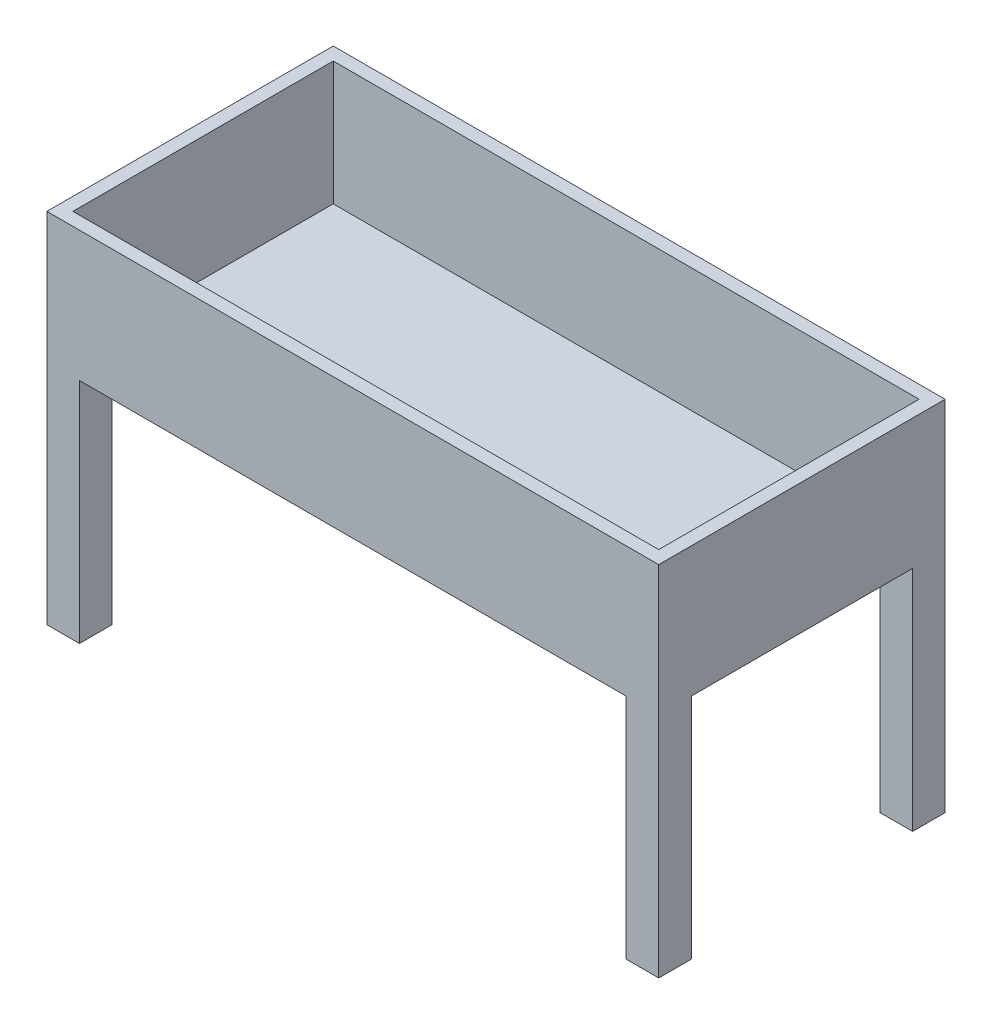
ISO-10303-21;
HEADER;
FILE_DESCRIPTION(('STEP AP214'),'2;1');
FILE_NAME('part.step','',(''),(''),'','','');
FILE_SCHEMA(('AUTOMOTIVE_DESIGN { 1 0 10303 214 1 1 1 1 }'));
ENDSEC;
DATA;
#1=APPLICATION_CONTEXT('core data for automotive mechanical design processes');
#2=APPLICATION_PROTOCOL_DEFINITION('international standard','automotive_design',2000,#1);
#3=PRODUCT_CONTEXT('',#1,'mechanical');
#4=PRODUCT('Part','Part','',(#3));
#5=PRODUCT_RELATED_PRODUCT_CATEGORY('part','',(#4));
#6=PRODUCT_DEFINITION_FORMATION('','',#4);
#7=PRODUCT_DEFINITION_CONTEXT('part definition',#1,'design');
#8=PRODUCT_DEFINITION('design','',#6,#7);
#9=PRODUCT_DEFINITION_SHAPE('','',#8);
#10=(LENGTH_UNIT() NAMED_UNIT(*) SI_UNIT(.MILLI.,.METRE.));
#11=(NAMED_UNIT(*) PLANE_ANGLE_UNIT() SI_UNIT($,.RADIAN.));
#12=(NAMED_UNIT(*) SI_UNIT($,.STERADIAN.) SOLID_ANGLE_UNIT());
#13=UNCERTAINTY_MEASURE_WITH_UNIT(LENGTH_MEASURE(1.E-05),#10,'distance_accuracy_value','');
#14=(GEOMETRIC_REPRESENTATION_CONTEXT(3) GLOBAL_UNCERTAINTY_ASSIGNED_CONTEXT((#13)) GLOBAL_UNIT_ASSIGNED_CONTEXT((#10,
#11,#12)) REPRESENTATION_CONTEXT('',''));
#15=CARTESIAN_POINT('',(0.,0.,0.));
#16=DIRECTION('',(0.,0.,1.));
#17=DIRECTION('',(1.,0.,0.));
#18=AXIS2_PLACEMENT_3D('',#15,#16,#17);
#19=CARTESIAN_POINT('',(0.,0.,0.));
#20=DIRECTION('',(0.,-1.,0.));
#21=DIRECTION('',(0.,0.,-1.));
#22=AXIS2_PLACEMENT_3D('',#19,#20,#21);
#23=PLANE('',#22);
#24=DIRECTION('',(-1.,0.,0.));
#25=VECTOR('',#24,1.);
#26=CARTESIAN_POINT('',(0.,0.,-39.));
#27=LINE('',#26,#25);
#28=CARTESIAN_POINT('',(5.,0.,-39.));
#29=VERTEX_POINT('',#28);
#30=CARTESIAN_POINT('',(0.,0.,-39.));
#31=VERTEX_POINT('',#30);
#32=EDGE_CURVE('E58',#29,#31,#27,.T.);
#33=ORIENTED_EDGE('',*,*,#32,.F.);
#34=DIRECTION('',(0.,0.,1.));
#35=VECTOR('',#34,1.);
#36=CARTESIAN_POINT('',(5.,0.,-44.));
#37=LINE('',#36,#35);
#38=CARTESIAN_POINT('',(5.,0.,-44.));
#39=VERTEX_POINT('',#38);
#40=EDGE_CURVE('E189',#39,#29,#37,.T.);
#41=ORIENTED_EDGE('',*,*,#40,.F.);
#42=DIRECTION('',(1.,0.,0.));
#43=VECTOR('',#42,1.);
#44=CARTESIAN_POINT('',(0.,0.,-44.));
#45=LINE('',#44,#43);
#46=CARTESIAN_POINT('',(89.,0.,-44.));
#47=VERTEX_POINT('',#46);
#48=EDGE_CURVE('E178',#39,#47,#45,.T.);
#49=ORIENTED_EDGE('',*,*,#48,.T.);
#50=DIRECTION('',(0.,0.,-1.));
#51=VECTOR('',#50,1.);
#52=CARTESIAN_POINT('',(89.,0.,-44.));
#53=LINE('',#52,#51);
#54=CARTESIAN_POINT('',(89.,0.,-39.));
#55=VERTEX_POINT('',#54);
#56=EDGE_CURVE('E221',#55,#47,#53,.T.);
#57=ORIENTED_EDGE('',*,*,#56,.F.);
#58=DIRECTION('',(-1.,0.,0.));
#59=VECTOR('',#58,1.);
#60=CARTESIAN_POINT('',(94.,0.,-39.));
#61=LINE('',#60,#59);
#62=CARTESIAN_POINT('',(94.,0.,-39.));
#63=VERTEX_POINT('',#62);
#64=EDGE_CURVE('E223',#63,#55,#61,.T.);
#65=ORIENTED_EDGE('',*,*,#64,.F.);
#66=DIRECTION('',(0.,0.,-1.));
#67=VECTOR('',#66,1.);
#68=CARTESIAN_POINT('',(94.,0.,0.));
#69=LINE('',#68,#67);
#70=CARTESIAN_POINT('',(94.,0.,-5.00000000000002));
#71=VERTEX_POINT('',#70);
#72=EDGE_CURVE('E187',#71,#63,#69,.T.);
#73=ORIENTED_EDGE('',*,*,#72,.F.);
#74=DIRECTION('',(1.,0.,0.));
#75=VECTOR('',#74,1.);
#76=CARTESIAN_POINT('',(94.,0.,-5.00000000000002));
#77=LINE('',#76,#75);
#78=CARTESIAN_POINT('',(89.,0.,-5.00000000000001));
#79=VERTEX_POINT('',#78);
#80=EDGE_CURVE('E243',#79,#71,#77,.T.);
#81=ORIENTED_EDGE('',*,*,#80,.F.);
#82=DIRECTION('',(0.,0.,-1.));
#83=VECTOR('',#82,1.);
#84=CARTESIAN_POINT('',(89.,0.,0.));
#85=LINE('',#84,#83);
#86=CARTESIAN_POINT('',(89.,0.,0.));
#87=VERTEX_POINT('',#86);
#88=EDGE_CURVE('E246',#87,#79,#85,.T.);
#89=ORIENTED_EDGE('',*,*,#88,.F.);
#90=DIRECTION('',(1.,0.,0.));
#91=VECTOR('',#90,1.);
#92=CARTESIAN_POINT('',(0.,0.,0.));
#93=LINE('',#92,#91);
#94=CARTESIAN_POINT('',(5.,0.,0.));
#95=VERTEX_POINT('',#94);
#96=EDGE_CURVE('E318',#95,#87,#93,.T.);
#97=ORIENTED_EDGE('',*,*,#96,.F.);
#98=DIRECTION('',(0.,0.,1.));
#99=VECTOR('',#98,1.);
#100=CARTESIAN_POINT('',(5.,0.,0.));
#101=LINE('',#100,#99);
#102=CARTESIAN_POINT('',(5.,0.,-5.));
#103=VERTEX_POINT('',#102);
#104=EDGE_CURVE('E262',#103,#95,#101,.T.);
#105=ORIENTED_EDGE('',*,*,#104,.F.);
#106=DIRECTION('',(1.,0.,0.));
#107=VECTOR('',#106,1.);
#108=CARTESIAN_POINT('',(0.,0.,-5.));
#109=LINE('',#108,#107);
#110=CARTESIAN_POINT('',(0.,0.,-5.));
#111=VERTEX_POINT('',#110);
#112=EDGE_CURVE('E249',#111,#103,#109,.T.);
#113=ORIENTED_EDGE('',*,*,#112,.F.);
#114=DIRECTION('',(0.,0.,-1.));
#115=VECTOR('',#114,1.);
#116=CARTESIAN_POINT('',(0.,0.,0.));
#117=LINE('',#116,#115);
#118=EDGE_CURVE('E63',#111,#31,#117,.T.);
#119=ORIENTED_EDGE('',*,*,#118,.T.);
#120=EDGE_LOOP('',(#33,#41,#49,#57,#65,#73,#81,#89,#97,#105,#113,#119));
#121=FACE_BOUND('',#120,.T.);
#122=ADVANCED_FACE('F41',(#121),#23,.T.);
#123=CARTESIAN_POINT('',(0.,20.,0.));
#124=DIRECTION('',(-1.,0.,0.));
#125=DIRECTION('',(0.,0.,1.));
#126=AXIS2_PLACEMENT_3D('',#123,#124,#125);
#127=PLANE('',#126);
#128=ORIENTED_EDGE('',*,*,#118,.F.);
#129=DIRECTION('',(0.,1.,0.));
#130=VECTOR('',#129,1.);
#131=CARTESIAN_POINT('',(0.,-35.,-5.));
#132=LINE('',#131,#130);
#133=CARTESIAN_POINT('',(0.,-35.,-5.));
#134=VERTEX_POINT('',#133);
#135=EDGE_CURVE('E279',#134,#111,#132,.T.);
#136=ORIENTED_EDGE('',*,*,#135,.F.);
#137=DIRECTION('',(0.,0.,-1.));
#138=VECTOR('',#137,1.);
#139=CARTESIAN_POINT('',(0.,-35.,0.));
#140=LINE('',#139,#138);
#141=CARTESIAN_POINT('',(0.,-35.,0.));
#142=VERTEX_POINT('',#141);
#143=EDGE_CURVE('E258',#142,#134,#140,.T.);
#144=ORIENTED_EDGE('',*,*,#143,.F.);
#145=DIRECTION('',(0.,-1.,0.));
#146=VECTOR('',#145,1.);
#147=CARTESIAN_POINT('',(0.,20.,0.));
#148=LINE('',#147,#146);
#149=CARTESIAN_POINT('',(0.,20.,0.));
#150=VERTEX_POINT('',#149);
#151=EDGE_CURVE('E11',#150,#142,#148,.T.);
#152=ORIENTED_EDGE('',*,*,#151,.F.);
#153=DIRECTION('',(0.,0.,-1.));
#154=VECTOR('',#153,1.);
#155=CARTESIAN_POINT('',(0.,20.,0.));
#156=LINE('',#155,#154);
#157=CARTESIAN_POINT('',(0.,20.,-44.));
#158=VERTEX_POINT('',#157);
#159=EDGE_CURVE('E314',#150,#158,#156,.T.);
#160=ORIENTED_EDGE('',*,*,#159,.T.);
#161=DIRECTION('',(0.,-1.,0.));
#162=VECTOR('',#161,1.);
#163=CARTESIAN_POINT('',(0.,20.,-44.));
#164=LINE('',#163,#162);
#165=CARTESIAN_POINT('',(0.,-35.,-44.));
#166=VERTEX_POINT('',#165);
#167=EDGE_CURVE('E45',#158,#166,#164,.T.);
#168=ORIENTED_EDGE('',*,*,#167,.T.);
#169=DIRECTION('',(0.,0.,-1.));
#170=VECTOR('',#169,1.);
#171=CARTESIAN_POINT('',(0.,-35.,-44.));
#172=LINE('',#171,#170);
#173=CARTESIAN_POINT('',(0.,-35.,-39.));
#174=VERTEX_POINT('',#173);
#175=EDGE_CURVE('E205',#174,#166,#172,.T.);
#176=ORIENTED_EDGE('',*,*,#175,.F.);
#177=DIRECTION('',(0.,1.,0.));
#178=VECTOR('',#177,1.);
#179=CARTESIAN_POINT('',(0.,-35.,-39.));
#180=LINE('',#179,#178);
#181=EDGE_CURVE('E200',#174,#31,#180,.T.);
#182=ORIENTED_EDGE('',*,*,#181,.T.);
#183=EDGE_LOOP('',(#128,#136,#144,#152,#160,#168,#176,#182));
#184=FACE_BOUND('',#183,.T.);
#185=ADVANCED_FACE('F43',(#184),#127,.T.);
#186=CARTESIAN_POINT('',(0.,20.,0.));
#187=DIRECTION('',(0.,0.,-1.));
#188=DIRECTION('',(-1.,0.,0.));
#189=AXIS2_PLACEMENT_3D('',#186,#187,#188);
#190=PLANE('',#189);
#191=ORIENTED_EDGE('',*,*,#151,.T.);
#192=DIRECTION('',(-1.,0.,0.));
#193=VECTOR('',#192,1.);
#194=CARTESIAN_POINT('',(0.,-35.,0.));
#195=LINE('',#194,#193);
#196=CARTESIAN_POINT('',(5.,-35.,0.));
#197=VERTEX_POINT('',#196);
#198=EDGE_CURVE('E266',#197,#142,#195,.T.);
#199=ORIENTED_EDGE('',*,*,#198,.F.);
#200=DIRECTION('',(0.,1.,0.));
#201=VECTOR('',#200,1.);
#202=CARTESIAN_POINT('',(5.,-35.,0.));
#203=LINE('',#202,#201);
#204=EDGE_CURVE('E269',#197,#95,#203,.T.);
#205=ORIENTED_EDGE('',*,*,#204,.T.);
#206=ORIENTED_EDGE('',*,*,#96,.T.);
#207=DIRECTION('',(0.,1.,0.));
#208=VECTOR('',#207,1.);
#209=CARTESIAN_POINT('',(89.,-35.,0.));
#210=LINE('',#209,#208);
#211=CARTESIAN_POINT('',(89.,-35.,0.));
#212=VERTEX_POINT('',#211);
#213=EDGE_CURVE('E227',#212,#87,#210,.T.);
#214=ORIENTED_EDGE('',*,*,#213,.F.);
#215=DIRECTION('',(-1.,0.,0.));
#216=VECTOR('',#215,1.);
#217=CARTESIAN_POINT('',(94.,-35.,0.));
#218=LINE('',#217,#216);
#219=CARTESIAN_POINT('',(94.,-35.,0.));
#220=VERTEX_POINT('',#219);
#221=EDGE_CURVE('E247',#220,#212,#218,.T.);
#222=ORIENTED_EDGE('',*,*,#221,.F.);
#223=DIRECTION('',(0.,-1.,0.));
#224=VECTOR('',#223,1.);
#225=CARTESIAN_POINT('',(94.,20.,0.));
#226=LINE('',#225,#224);
#227=CARTESIAN_POINT('',(94.,20.,0.));
#228=VERTEX_POINT('',#227);
#229=EDGE_CURVE('E50',#228,#220,#226,.T.);
#230=ORIENTED_EDGE('',*,*,#229,.F.);
#231=DIRECTION('',(1.,0.,0.));
#232=VECTOR('',#231,1.);
#233=CARTESIAN_POINT('',(0.,20.,0.));
#234=LINE('',#233,#232);
#235=EDGE_CURVE('E323',#150,#228,#234,.T.);
#236=ORIENTED_EDGE('',*,*,#235,.F.);
#237=EDGE_LOOP('',(#191,#199,#205,#206,#214,#222,#230,#236));
#238=FACE_BOUND('',#237,.T.);
#239=ADVANCED_FACE('F354',(#238),#190,.F.);
#240=CARTESIAN_POINT('',(94.,20.,0.));
#241=DIRECTION('',(-1.,0.,0.));
#242=DIRECTION('',(0.,0.,1.));
#243=AXIS2_PLACEMENT_3D('',#240,#241,#242);
#244=PLANE('',#243);
#245=ORIENTED_EDGE('',*,*,#229,.T.);
#246=DIRECTION('',(0.,0.,1.));
#247=VECTOR('',#246,1.);
#248=CARTESIAN_POINT('',(94.,-35.,0.));
#249=LINE('',#248,#247);
#250=CARTESIAN_POINT('',(94.,-35.,-5.00000000000002));
#251=VERTEX_POINT('',#250);
#252=EDGE_CURVE('E242',#251,#220,#249,.T.);
#253=ORIENTED_EDGE('',*,*,#252,.F.);
#254=DIRECTION('',(0.,1.,0.));
#255=VECTOR('',#254,1.);
#256=CARTESIAN_POINT('',(94.,-35.,-5.00000000000002));
#257=LINE('',#256,#255);
#258=EDGE_CURVE('E240',#251,#71,#257,.T.);
#259=ORIENTED_EDGE('',*,*,#258,.T.);
#260=ORIENTED_EDGE('',*,*,#72,.T.);
#261=DIRECTION('',(0.,1.,0.));
#262=VECTOR('',#261,1.);
#263=CARTESIAN_POINT('',(94.,-35.,-39.));
#264=LINE('',#263,#262);
#265=CARTESIAN_POINT('',(94.,-35.,-39.));
#266=VERTEX_POINT('',#265);
#267=EDGE_CURVE('E193',#266,#63,#264,.T.);
#268=ORIENTED_EDGE('',*,*,#267,.F.);
#269=DIRECTION('',(0.,0.,1.));
#270=VECTOR('',#269,1.);
#271=CARTESIAN_POINT('',(94.,-35.,-44.));
#272=LINE('',#271,#270);
#273=CARTESIAN_POINT('',(94.,-35.,-44.));
#274=VERTEX_POINT('',#273);
#275=EDGE_CURVE('E224',#274,#266,#272,.T.);
#276=ORIENTED_EDGE('',*,*,#275,.F.);
#277=DIRECTION('',(0.,-1.,0.));
#278=VECTOR('',#277,1.);
#279=CARTESIAN_POINT('',(94.,20.,-44.));
#280=LINE('',#279,#278);
#281=CARTESIAN_POINT('',(94.,20.,-44.));
#282=VERTEX_POINT('',#281);
#283=EDGE_CURVE('E330',#282,#274,#280,.T.);
#284=ORIENTED_EDGE('',*,*,#283,.F.);
#285=DIRECTION('',(0.,0.,-1.));
#286=VECTOR('',#285,1.);
#287=CARTESIAN_POINT('',(94.,20.,0.));
#288=LINE('',#287,#286);
#289=EDGE_CURVE('E321',#228,#282,#288,.T.);
#290=ORIENTED_EDGE('',*,*,#289,.F.);
#291=EDGE_LOOP('',(#245,#253,#259,#260,#268,#276,#284,#290));
#292=FACE_BOUND('',#291,.T.);
#293=ADVANCED_FACE('F361',(#292),#244,.F.);
#294=CARTESIAN_POINT('',(0.,20.,-44.));
#295=DIRECTION('',(0.,0.,-1.));
#296=DIRECTION('',(-1.,0.,0.));
#297=AXIS2_PLACEMENT_3D('',#294,#295,#296);
#298=PLANE('',#297);
#299=ORIENTED_EDGE('',*,*,#48,.F.);
#300=DIRECTION('',(0.,1.,0.));
#301=VECTOR('',#300,1.);
#302=CARTESIAN_POINT('',(5.,-35.,-44.));
#303=LINE('',#302,#301);
#304=CARTESIAN_POINT('',(5.,-35.,-44.));
#305=VERTEX_POINT('',#304);
#306=EDGE_CURVE('E182',#305,#39,#303,.T.);
#307=ORIENTED_EDGE('',*,*,#306,.F.);
#308=DIRECTION('',(1.,0.,0.));
#309=VECTOR('',#308,1.);
#310=CARTESIAN_POINT('',(0.,-35.,-44.));
#311=LINE('',#310,#309);
#312=EDGE_CURVE('E206',#166,#305,#311,.T.);
#313=ORIENTED_EDGE('',*,*,#312,.F.);
#314=ORIENTED_EDGE('',*,*,#167,.F.);
#315=DIRECTION('',(1.,0.,0.));
#316=VECTOR('',#315,1.);
#317=CARTESIAN_POINT('',(0.,20.,-44.));
#318=LINE('',#317,#316);
#319=EDGE_CURVE('E317',#158,#282,#318,.T.);
#320=ORIENTED_EDGE('',*,*,#319,.T.);
#321=ORIENTED_EDGE('',*,*,#283,.T.);
#322=DIRECTION('',(1.,0.,0.));
#323=VECTOR('',#322,1.);
#324=CARTESIAN_POINT('',(94.,-35.,-44.));
#325=LINE('',#324,#323);
#326=CARTESIAN_POINT('',(89.,-35.,-44.));
#327=VERTEX_POINT('',#326);
#328=EDGE_CURVE('E220',#327,#274,#325,.T.);
#329=ORIENTED_EDGE('',*,*,#328,.F.);
#330=DIRECTION('',(0.,1.,0.));
#331=VECTOR('',#330,1.);
#332=CARTESIAN_POINT('',(89.,-35.,-44.));
#333=LINE('',#332,#331);
#334=EDGE_CURVE('E185',#327,#47,#333,.T.);
#335=ORIENTED_EDGE('',*,*,#334,.T.);
#336=EDGE_LOOP('',(#299,#307,#313,#314,#320,#321,#329,#335));
#337=FACE_BOUND('',#336,.T.);
#338=ADVANCED_FACE('F179',(#337),#298,.T.);
#339=CARTESIAN_POINT('',(0.,20.,0.));
#340=DIRECTION('',(0.,-1.,0.));
#341=DIRECTION('',(0.,0.,-1.));
#342=AXIS2_PLACEMENT_3D('',#339,#340,#341);
#343=PLANE('',#342);
#344=DIRECTION('',(-1.,0.,0.));
#345=VECTOR('',#344,1.);
#346=CARTESIAN_POINT('',(2.,20.,-42.));
#347=LINE('',#346,#345);
#348=CARTESIAN_POINT('',(92.,20.,-42.));
#349=VERTEX_POINT('',#348);
#350=CARTESIAN_POINT('',(2.,20.,-42.));
#351=VERTEX_POINT('',#350);
#352=EDGE_CURVE('E298',#349,#351,#347,.T.);
#353=ORIENTED_EDGE('',*,*,#352,.F.);
#354=DIRECTION('',(0.,0.,-1.));
#355=VECTOR('',#354,1.);
#356=CARTESIAN_POINT('',(92.,20.,-42.));
#357=LINE('',#356,#355);
#358=CARTESIAN_POINT('',(92.,20.,-1.99999999999998));
#359=VERTEX_POINT('',#358);
#360=EDGE_CURVE('E282',#359,#349,#357,.T.);
#361=ORIENTED_EDGE('',*,*,#360,.F.);
#362=DIRECTION('',(1.,0.,0.));
#363=VECTOR('',#362,1.);
#364=CARTESIAN_POINT('',(2.00000000000001,20.,-1.99999999999998));
#365=LINE('',#364,#363);
#366=CARTESIAN_POINT('',(2.00000000000001,20.,-1.99999999999998));
#367=VERTEX_POINT('',#366);
#368=EDGE_CURVE('E287',#367,#359,#365,.T.);
#369=ORIENTED_EDGE('',*,*,#368,.F.);
#370=DIRECTION('',(0.,0.,1.));
#371=VECTOR('',#370,1.);
#372=CARTESIAN_POINT('',(2.,20.,-42.));
#373=LINE('',#372,#371);
#374=EDGE_CURVE('E301',#351,#367,#373,.T.);
#375=ORIENTED_EDGE('',*,*,#374,.F.);
#376=EDGE_LOOP('',(#353,#361,#369,#375));
#377=FACE_BOUND('',#376,.T.);
#378=ORIENTED_EDGE('',*,*,#159,.F.);
#379=ORIENTED_EDGE('',*,*,#235,.T.);
#380=ORIENTED_EDGE('',*,*,#289,.T.);
#381=ORIENTED_EDGE('',*,*,#319,.F.);
#382=EDGE_LOOP('',(#378,#379,#380,#381));
#383=FACE_BOUND('',#382,.T.);
#384=ADVANCED_FACE('F358',(#377,#383),#343,.F.);
#385=CARTESIAN_POINT('',(92.,1.,-42.));
#386=DIRECTION('',(1.,0.,0.));
#387=DIRECTION('',(0.,0.,-1.));
#388=AXIS2_PLACEMENT_3D('',#385,#386,#387);
#389=PLANE('',#388);
#390=ORIENTED_EDGE('',*,*,#360,.T.);
#391=DIRECTION('',(0.,1.,0.));
#392=VECTOR('',#391,1.);
#393=CARTESIAN_POINT('',(92.,1.,-42.));
#394=LINE('',#393,#392);
#395=CARTESIAN_POINT('',(92.,1.,-42.));
#396=VERTEX_POINT('',#395);
#397=EDGE_CURVE('E296',#396,#349,#394,.T.);
#398=ORIENTED_EDGE('',*,*,#397,.F.);
#399=DIRECTION('',(0.,0.,-1.));
#400=VECTOR('',#399,1.);
#401=CARTESIAN_POINT('',(92.,1.,-42.));
#402=LINE('',#401,#400);
#403=CARTESIAN_POINT('',(92.,1.,-1.99999999999998));
#404=VERTEX_POINT('',#403);
#405=EDGE_CURVE('E283',#404,#396,#402,.T.);
#406=ORIENTED_EDGE('',*,*,#405,.F.);
#407=DIRECTION('',(0.,1.,0.));
#408=VECTOR('',#407,1.);
#409=CARTESIAN_POINT('',(92.,1.,-1.99999999999998));
#410=LINE('',#409,#408);
#411=EDGE_CURVE('E306',#404,#359,#410,.T.);
#412=ORIENTED_EDGE('',*,*,#411,.T.);
#413=EDGE_LOOP('',(#390,#398,#406,#412));
#414=FACE_BOUND('',#413,.T.);
#415=ADVANCED_FACE('F399',(#414),#389,.F.);
#416=CARTESIAN_POINT('',(2.00000000000001,1.,-1.99999999999998));
#417=DIRECTION('',(0.,0.,1.));
#418=DIRECTION('',(1.,0.,0.));
#419=AXIS2_PLACEMENT_3D('',#416,#417,#418);
#420=PLANE('',#419);
#421=ORIENTED_EDGE('',*,*,#368,.T.);
#422=ORIENTED_EDGE('',*,*,#411,.F.);
#423=DIRECTION('',(1.,0.,0.));
#424=VECTOR('',#423,1.);
#425=CARTESIAN_POINT('',(2.00000000000001,1.,-1.99999999999998));
#426=LINE('',#425,#424);
#427=CARTESIAN_POINT('',(2.00000000000001,1.,-1.99999999999998));
#428=VERTEX_POINT('',#427);
#429=EDGE_CURVE('E293',#428,#404,#426,.T.);
#430=ORIENTED_EDGE('',*,*,#429,.F.);
#431=DIRECTION('',(0.,1.,0.));
#432=VECTOR('',#431,1.);
#433=CARTESIAN_POINT('',(2.00000000000001,1.,-1.99999999999998));
#434=LINE('',#433,#432);
#435=EDGE_CURVE('E308',#428,#367,#434,.T.);
#436=ORIENTED_EDGE('',*,*,#435,.T.);
#437=EDGE_LOOP('',(#421,#422,#430,#436));
#438=FACE_BOUND('',#437,.T.);
#439=ADVANCED_FACE('F404',(#438),#420,.F.);
#440=CARTESIAN_POINT('',(2.,1.,-42.));
#441=DIRECTION('',(-1.,0.,0.));
#442=DIRECTION('',(0.,0.,1.));
#443=AXIS2_PLACEMENT_3D('',#440,#441,#442);
#444=PLANE('',#443);
#445=ORIENTED_EDGE('',*,*,#374,.T.);
#446=ORIENTED_EDGE('',*,*,#435,.F.);
#447=DIRECTION('',(0.,0.,1.));
#448=VECTOR('',#447,1.);
#449=CARTESIAN_POINT('',(2.,1.,-42.));
#450=LINE('',#449,#448);
#451=CARTESIAN_POINT('',(2.,1.,-42.));
#452=VERTEX_POINT('',#451);
#453=EDGE_CURVE('E290',#452,#428,#450,.T.);
#454=ORIENTED_EDGE('',*,*,#453,.F.);
#455=DIRECTION('',(0.,1.,0.));
#456=VECTOR('',#455,1.);
#457=CARTESIAN_POINT('',(2.,1.,-42.));
#458=LINE('',#457,#456);
#459=EDGE_CURVE('E310',#452,#351,#458,.T.);
#460=ORIENTED_EDGE('',*,*,#459,.T.);
#461=EDGE_LOOP('',(#445,#446,#454,#460));
#462=FACE_BOUND('',#461,.T.);
#463=ADVANCED_FACE('F418',(#462),#444,.F.);
#464=CARTESIAN_POINT('',(2.,1.,-42.));
#465=DIRECTION('',(0.,0.,-1.));
#466=DIRECTION('',(-1.,0.,0.));
#467=AXIS2_PLACEMENT_3D('',#464,#465,#466);
#468=PLANE('',#467);
#469=ORIENTED_EDGE('',*,*,#352,.T.);
#470=ORIENTED_EDGE('',*,*,#459,.F.);
#471=DIRECTION('',(-1.,0.,0.));
#472=VECTOR('',#471,1.);
#473=CARTESIAN_POINT('',(2.,1.,-42.));
#474=LINE('',#473,#472);
#475=EDGE_CURVE('E286',#396,#452,#474,.T.);
#476=ORIENTED_EDGE('',*,*,#475,.F.);
#477=ORIENTED_EDGE('',*,*,#397,.T.);
#478=EDGE_LOOP('',(#469,#470,#476,#477));
#479=FACE_BOUND('',#478,.T.);
#480=ADVANCED_FACE('F411',(#479),#468,.F.);
#481=CARTESIAN_POINT('',(0.,1.,0.));
#482=DIRECTION('',(0.,1.,0.));
#483=DIRECTION('',(0.,0.,1.));
#484=AXIS2_PLACEMENT_3D('',#481,#482,#483);
#485=PLANE('',#484);
#486=ORIENTED_EDGE('',*,*,#405,.T.);
#487=ORIENTED_EDGE('',*,*,#475,.T.);
#488=ORIENTED_EDGE('',*,*,#453,.T.);
#489=ORIENTED_EDGE('',*,*,#429,.T.);
#490=EDGE_LOOP('',(#486,#487,#488,#489));
#491=FACE_BOUND('',#490,.T.);
#492=ADVANCED_FACE('F420',(#491),#485,.T.);
#493=CARTESIAN_POINT('',(0.,-35.,-5.));
#494=DIRECTION('',(0.,0.,1.));
#495=DIRECTION('',(1.,0.,0.));
#496=AXIS2_PLACEMENT_3D('',#493,#494,#495);
#497=PLANE('',#496);
#498=ORIENTED_EDGE('',*,*,#112,.T.);
#499=DIRECTION('',(0.,1.,0.));
#500=VECTOR('',#499,1.);
#501=CARTESIAN_POINT('',(5.,-35.,-5.));
#502=LINE('',#501,#500);
#503=CARTESIAN_POINT('',(5.,-35.,-5.));
#504=VERTEX_POINT('',#503);
#505=EDGE_CURVE('E276',#504,#103,#502,.T.);
#506=ORIENTED_EDGE('',*,*,#505,.F.);
#507=DIRECTION('',(1.,0.,0.));
#508=VECTOR('',#507,1.);
#509=CARTESIAN_POINT('',(0.,-35.,-5.));
#510=LINE('',#509,#508);
#511=EDGE_CURVE('E261',#134,#504,#510,.T.);
#512=ORIENTED_EDGE('',*,*,#511,.F.);
#513=ORIENTED_EDGE('',*,*,#135,.T.);
#514=EDGE_LOOP('',(#498,#506,#512,#513));
#515=FACE_BOUND('',#514,.T.);
#516=ADVANCED_FACE('F345',(#515),#497,.F.);
#517=CARTESIAN_POINT('',(5.,-35.,0.));
#518=DIRECTION('',(-1.,0.,0.));
#519=DIRECTION('',(0.,0.,1.));
#520=AXIS2_PLACEMENT_3D('',#517,#518,#519);
#521=PLANE('',#520);
#522=ORIENTED_EDGE('',*,*,#104,.T.);
#523=ORIENTED_EDGE('',*,*,#204,.F.);
#524=DIRECTION('',(0.,0.,1.));
#525=VECTOR('',#524,1.);
#526=CARTESIAN_POINT('',(5.,-35.,0.));
#527=LINE('',#526,#525);
#528=EDGE_CURVE('E264',#504,#197,#527,.T.);
#529=ORIENTED_EDGE('',*,*,#528,.F.);
#530=ORIENTED_EDGE('',*,*,#505,.T.);
#531=EDGE_LOOP('',(#522,#523,#529,#530));
#532=FACE_BOUND('',#531,.T.);
#533=ADVANCED_FACE('F427',(#532),#521,.F.);
#534=CARTESIAN_POINT('',(0.,-35.,0.));
#535=DIRECTION('',(0.,-1.,0.));
#536=DIRECTION('',(0.,0.,-1.));
#537=AXIS2_PLACEMENT_3D('',#534,#535,#536);
#538=PLANE('',#537);
#539=ORIENTED_EDGE('',*,*,#143,.T.);
#540=ORIENTED_EDGE('',*,*,#511,.T.);
#541=ORIENTED_EDGE('',*,*,#528,.T.);
#542=ORIENTED_EDGE('',*,*,#198,.T.);
#543=EDGE_LOOP('',(#539,#540,#541,#542));
#544=FACE_BOUND('',#543,.T.);
#545=ADVANCED_FACE('F349',(#544),#538,.T.);
#546=CARTESIAN_POINT('',(89.,-35.,0.));
#547=DIRECTION('',(1.,0.,0.));
#548=DIRECTION('',(0.,0.,-1.));
#549=AXIS2_PLACEMENT_3D('',#546,#547,#548);
#550=PLANE('',#549);
#551=ORIENTED_EDGE('',*,*,#88,.T.);
#552=DIRECTION('',(0.,1.,0.));
#553=VECTOR('',#552,1.);
#554=CARTESIAN_POINT('',(89.,-35.,-5.00000000000001));
#555=LINE('',#554,#553);
#556=CARTESIAN_POINT('',(89.,-35.,-5.00000000000001));
#557=VERTEX_POINT('',#556);
#558=EDGE_CURVE('E237',#557,#79,#555,.T.);
#559=ORIENTED_EDGE('',*,*,#558,.F.);
#560=DIRECTION('',(0.,0.,-1.));
#561=VECTOR('',#560,1.);
#562=CARTESIAN_POINT('',(89.,-35.,0.));
#563=LINE('',#562,#561);
#564=EDGE_CURVE('E254',#212,#557,#563,.T.);
#565=ORIENTED_EDGE('',*,*,#564,.F.);
#566=ORIENTED_EDGE('',*,*,#213,.T.);
#567=EDGE_LOOP('',(#551,#559,#565,#566));
#568=FACE_BOUND('',#567,.T.);
#569=ADVANCED_FACE('F510',(#568),#550,.F.);
#570=CARTESIAN_POINT('',(94.,-35.,-5.00000000000002));
#571=DIRECTION('',(0.,0.,1.));
#572=DIRECTION('',(1.,0.,0.));
#573=AXIS2_PLACEMENT_3D('',#570,#571,#572);
#574=PLANE('',#573);
#575=ORIENTED_EDGE('',*,*,#80,.T.);
#576=ORIENTED_EDGE('',*,*,#258,.F.);
#577=DIRECTION('',(1.,0.,0.));
#578=VECTOR('',#577,1.);
#579=CARTESIAN_POINT('',(94.,-35.,-5.00000000000002));
#580=LINE('',#579,#578);
#581=EDGE_CURVE('E252',#557,#251,#580,.T.);
#582=ORIENTED_EDGE('',*,*,#581,.F.);
#583=ORIENTED_EDGE('',*,*,#558,.T.);
#584=EDGE_LOOP('',(#575,#576,#582,#583));
#585=FACE_BOUND('',#584,.T.);
#586=ADVANCED_FACE('F380',(#585),#574,.F.);
#587=CARTESIAN_POINT('',(0.,-35.,0.));
#588=DIRECTION('',(0.,-1.,0.));
#589=DIRECTION('',(0.,0.,-1.));
#590=AXIS2_PLACEMENT_3D('',#587,#588,#589);
#591=PLANE('',#590);
#592=ORIENTED_EDGE('',*,*,#221,.T.);
#593=ORIENTED_EDGE('',*,*,#564,.T.);
#594=ORIENTED_EDGE('',*,*,#581,.T.);
#595=ORIENTED_EDGE('',*,*,#252,.T.);
#596=EDGE_LOOP('',(#592,#593,#594,#595));
#597=FACE_BOUND('',#596,.T.);
#598=ADVANCED_FACE('F373',(#597),#591,.T.);
#599=CARTESIAN_POINT('',(94.,-35.,-39.));
#600=DIRECTION('',(0.,0.,-1.));
#601=DIRECTION('',(-1.,0.,0.));
#602=AXIS2_PLACEMENT_3D('',#599,#600,#601);
#603=PLANE('',#602);
#604=ORIENTED_EDGE('',*,*,#64,.T.);
#605=DIRECTION('',(0.,1.,0.));
#606=VECTOR('',#605,1.);
#607=CARTESIAN_POINT('',(89.,-35.,-39.));
#608=LINE('',#607,#606);
#609=CARTESIAN_POINT('',(89.,-35.,-39.));
#610=VERTEX_POINT('',#609);
#611=EDGE_CURVE('E216',#610,#55,#608,.T.);
#612=ORIENTED_EDGE('',*,*,#611,.F.);
#613=DIRECTION('',(-1.,0.,0.));
#614=VECTOR('',#613,1.);
#615=CARTESIAN_POINT('',(94.,-35.,-39.));
#616=LINE('',#615,#614);
#617=EDGE_CURVE('E232',#266,#610,#616,.T.);
#618=ORIENTED_EDGE('',*,*,#617,.F.);
#619=ORIENTED_EDGE('',*,*,#267,.T.);
#620=EDGE_LOOP('',(#604,#612,#618,#619));
#621=FACE_BOUND('',#620,.T.);
#622=ADVANCED_FACE('F371',(#621),#603,.F.);
#623=CARTESIAN_POINT('',(89.,-35.,-44.));
#624=DIRECTION('',(1.,0.,0.));
#625=DIRECTION('',(0.,0.,-1.));
#626=AXIS2_PLACEMENT_3D('',#623,#624,#625);
#627=PLANE('',#626);
#628=ORIENTED_EDGE('',*,*,#56,.T.);
#629=ORIENTED_EDGE('',*,*,#334,.F.);
#630=DIRECTION('',(0.,0.,-1.));
#631=VECTOR('',#630,1.);
#632=CARTESIAN_POINT('',(89.,-35.,-44.));
#633=LINE('',#632,#631);
#634=EDGE_CURVE('E230',#610,#327,#633,.T.);
#635=ORIENTED_EDGE('',*,*,#634,.F.);
#636=ORIENTED_EDGE('',*,*,#611,.T.);
#637=EDGE_LOOP('',(#628,#629,#635,#636));
#638=FACE_BOUND('',#637,.T.);
#639=ADVANCED_FACE('F368',(#638),#627,.F.);
#640=CARTESIAN_POINT('',(0.,-35.,0.));
#641=DIRECTION('',(0.,-1.,0.));
#642=DIRECTION('',(0.,0.,-1.));
#643=AXIS2_PLACEMENT_3D('',#640,#641,#642);
#644=PLANE('',#643);
#645=ORIENTED_EDGE('',*,*,#275,.T.);
#646=ORIENTED_EDGE('',*,*,#617,.T.);
#647=ORIENTED_EDGE('',*,*,#634,.T.);
#648=ORIENTED_EDGE('',*,*,#328,.T.);
#649=EDGE_LOOP('',(#645,#646,#647,#648));
#650=FACE_BOUND('',#649,.T.);
#651=ADVANCED_FACE('F364',(#650),#644,.T.);
#652=CARTESIAN_POINT('',(5.,-35.,-44.));
#653=DIRECTION('',(-1.,0.,0.));
#654=DIRECTION('',(0.,0.,1.));
#655=AXIS2_PLACEMENT_3D('',#652,#653,#654);
#656=PLANE('',#655);
#657=ORIENTED_EDGE('',*,*,#40,.T.);
#658=DIRECTION('',(0.,1.,0.));
#659=VECTOR('',#658,1.);
#660=CARTESIAN_POINT('',(5.,-35.,-39.));
#661=LINE('',#660,#659);
#662=CARTESIAN_POINT('',(5.,-35.,-39.));
#663=VERTEX_POINT('',#662);
#664=EDGE_CURVE('E198',#663,#29,#661,.T.);
#665=ORIENTED_EDGE('',*,*,#664,.F.);
#666=DIRECTION('',(0.,0.,1.));
#667=VECTOR('',#666,1.);
#668=CARTESIAN_POINT('',(5.,-35.,-44.));
#669=LINE('',#668,#667);
#670=EDGE_CURVE('E196',#305,#663,#669,.T.);
#671=ORIENTED_EDGE('',*,*,#670,.F.);
#672=ORIENTED_EDGE('',*,*,#306,.T.);
#673=EDGE_LOOP('',(#657,#665,#671,#672));
#674=FACE_BOUND('',#673,.T.);
#675=ADVANCED_FACE('F195',(#674),#656,.F.);
#676=CARTESIAN_POINT('',(0.,-35.,-39.));
#677=DIRECTION('',(0.,0.,-1.));
#678=DIRECTION('',(-1.,0.,0.));
#679=AXIS2_PLACEMENT_3D('',#676,#677,#678);
#680=PLANE('',#679);
#681=ORIENTED_EDGE('',*,*,#32,.T.);
#682=ORIENTED_EDGE('',*,*,#181,.F.);
#683=DIRECTION('',(-1.,0.,0.));
#684=VECTOR('',#683,1.);
#685=CARTESIAN_POINT('',(0.,-35.,-39.));
#686=LINE('',#685,#684);
#687=EDGE_CURVE('E210',#663,#174,#686,.T.);
#688=ORIENTED_EDGE('',*,*,#687,.F.);
#689=ORIENTED_EDGE('',*,*,#664,.T.);
#690=EDGE_LOOP('',(#681,#682,#688,#689));
#691=FACE_BOUND('',#690,.T.);
#692=ADVANCED_FACE('F341',(#691),#680,.F.);
#693=CARTESIAN_POINT('',(0.,-35.,0.));
#694=DIRECTION('',(0.,-1.,0.));
#695=DIRECTION('',(0.,0.,-1.));
#696=AXIS2_PLACEMENT_3D('',#693,#694,#695);
#697=PLANE('',#696);
#698=ORIENTED_EDGE('',*,*,#312,.T.);
#699=ORIENTED_EDGE('',*,*,#670,.T.);
#700=ORIENTED_EDGE('',*,*,#687,.T.);
#701=ORIENTED_EDGE('',*,*,#175,.T.);
#702=EDGE_LOOP('',(#698,#699,#700,#701));
#703=FACE_BOUND('',#702,.T.);
#704=ADVANCED_FACE('F337',(#703),#697,.T.);
#705=CLOSED_SHELL('',(#122,#185,#239,#293,#338,#384,#415,#439,#463,#480,#492,#516,#533,#545,
#569,#586,#598,#622,#639,#651,#675,#692,#704));
#706=MANIFOLD_SOLID_BREP('B2',#705);
#707=ADVANCED_BREP_SHAPE_REPRESENTATION('',(#18,#706),#14);
#708=SHAPE_DEFINITION_REPRESENTATION(#9,#707);
ENDSEC;
END-ISO-10303-21;
